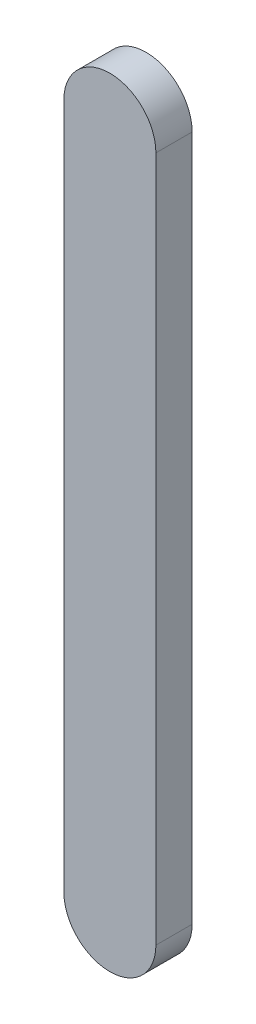
ISO-10303-21;
HEADER;
FILE_DESCRIPTION(('STEP AP214'),'2;1');
FILE_NAME('part.step','',(''),(''),'','','');
FILE_SCHEMA(('AUTOMOTIVE_DESIGN { 1 0 10303 214 1 1 1 1 }'));
ENDSEC;
DATA;
#1=APPLICATION_CONTEXT('core data for automotive mechanical design processes');
#2=APPLICATION_PROTOCOL_DEFINITION('international standard','automotive_design',2000,#1);
#3=PRODUCT_CONTEXT('',#1,'mechanical');
#4=PRODUCT('Part','Part','',(#3));
#5=PRODUCT_RELATED_PRODUCT_CATEGORY('part','',(#4));
#6=PRODUCT_DEFINITION_FORMATION('','',#4);
#7=PRODUCT_DEFINITION_CONTEXT('part definition',#1,'design');
#8=PRODUCT_DEFINITION('design','',#6,#7);
#9=PRODUCT_DEFINITION_SHAPE('','',#8);
#10=(LENGTH_UNIT() NAMED_UNIT(*) SI_UNIT(.MILLI.,.METRE.));
#11=(NAMED_UNIT(*) PLANE_ANGLE_UNIT() SI_UNIT($,.RADIAN.));
#12=(NAMED_UNIT(*) SI_UNIT($,.STERADIAN.) SOLID_ANGLE_UNIT());
#13=UNCERTAINTY_MEASURE_WITH_UNIT(LENGTH_MEASURE(1.E-05),#10,'distance_accuracy_value','');
#14=(GEOMETRIC_REPRESENTATION_CONTEXT(3) GLOBAL_UNCERTAINTY_ASSIGNED_CONTEXT((#13)) GLOBAL_UNIT_ASSIGNED_CONTEXT((#10,
#11,#12)) REPRESENTATION_CONTEXT('',''));
#15=CARTESIAN_POINT('',(0.,0.,0.));
#16=DIRECTION('',(0.,0.,1.));
#17=DIRECTION('',(1.,0.,0.));
#18=AXIS2_PLACEMENT_3D('',#15,#16,#17);
#19=CARTESIAN_POINT('',(147.828,107.5660028,0.));
#20=DIRECTION('',(-1.,0.,0.));
#21=DIRECTION('',(0.,1.,0.));
#22=AXIS2_PLACEMENT_3D('',#19,#20,#21);
#23=PLANE('',#22);
#24=DIRECTION('',(0.,1.,0.));
#25=VECTOR('',#24,1.);
#26=CARTESIAN_POINT('',(147.828,107.5660028,0.1999996));
#27=LINE('',#26,#25);
#28=CARTESIAN_POINT('',(147.828,107.5660028,0.1999996));
#29=VERTEX_POINT('',#28);
#30=CARTESIAN_POINT('',(147.828,111.3536,0.1999996));
#31=VERTEX_POINT('',#30);
#32=EDGE_CURVE('E11',#29,#31,#27,.T.);
#33=ORIENTED_EDGE('',*,*,#32,.F.);
#34=DIRECTION('',(0.,0.,1.));
#35=VECTOR('',#34,1.);
#36=CARTESIAN_POINT('',(147.828,107.5660028,0.));
#37=LINE('',#36,#35);
#38=CARTESIAN_POINT('',(147.828,107.5660028,0.));
#39=VERTEX_POINT('',#38);
#40=EDGE_CURVE('E24',#39,#29,#37,.T.);
#41=ORIENTED_EDGE('',*,*,#40,.F.);
#42=DIRECTION('',(0.,1.,0.));
#43=VECTOR('',#42,1.);
#44=CARTESIAN_POINT('',(147.828,107.5660028,0.));
#45=LINE('',#44,#43);
#46=CARTESIAN_POINT('',(147.828,111.3536,0.));
#47=VERTEX_POINT('',#46);
#48=EDGE_CURVE('E75',#39,#47,#45,.T.);
#49=ORIENTED_EDGE('',*,*,#48,.T.);
#50=DIRECTION('',(0.,0.,1.));
#51=VECTOR('',#50,1.);
#52=CARTESIAN_POINT('',(147.828,111.3536,0.));
#53=LINE('',#52,#51);
#54=EDGE_CURVE('E37',#47,#31,#53,.T.);
#55=ORIENTED_EDGE('',*,*,#54,.T.);
#56=EDGE_LOOP('',(#33,#41,#49,#55));
#57=FACE_BOUND('',#56,.T.);
#58=ADVANCED_FACE('F17',(#57),#23,.F.);
#59=CARTESIAN_POINT('',(147.574,111.3536,0.));
#60=DIRECTION('',(0.,0.,-1.));
#61=DIRECTION('',(1.,0.,0.));
#62=AXIS2_PLACEMENT_3D('',#59,#60,#61);
#63=CYLINDRICAL_SURFACE('',#62,0.254000000000005);
#64=CARTESIAN_POINT('',(147.574,111.3536,0.1999996));
#65=DIRECTION('',(0.,0.,1.));
#66=DIRECTION('',(1.,0.,0.));
#67=AXIS2_PLACEMENT_3D('',#64,#65,#66);
#68=CIRCLE('',#67,0.254000000000005);
#69=CARTESIAN_POINT('',(147.32,111.3536,0.1999996));
#70=VERTEX_POINT('',#69);
#71=EDGE_CURVE('E83',#31,#70,#68,.T.);
#72=ORIENTED_EDGE('',*,*,#71,.F.);
#73=ORIENTED_EDGE('',*,*,#54,.F.);
#74=CARTESIAN_POINT('',(147.574,111.3536,0.));
#75=DIRECTION('',(0.,0.,1.));
#76=DIRECTION('',(1.,0.,0.));
#77=AXIS2_PLACEMENT_3D('',#74,#75,#76);
#78=CIRCLE('',#77,0.254000000000005);
#79=CARTESIAN_POINT('',(147.32,111.3536,0.));
#80=VERTEX_POINT('',#79);
#81=EDGE_CURVE('E81',#47,#80,#78,.T.);
#82=ORIENTED_EDGE('',*,*,#81,.T.);
#83=DIRECTION('',(0.,0.,1.));
#84=VECTOR('',#83,1.);
#85=CARTESIAN_POINT('',(147.32,111.3536,0.));
#86=LINE('',#85,#84);
#87=EDGE_CURVE('E67',#80,#70,#86,.T.);
#88=ORIENTED_EDGE('',*,*,#87,.T.);
#89=EDGE_LOOP('',(#72,#73,#82,#88));
#90=FACE_BOUND('',#89,.T.);
#91=ADVANCED_FACE('F89',(#90),#63,.T.);
#92=CARTESIAN_POINT('',(147.32,111.3536,0.));
#93=DIRECTION('',(1.,0.,0.));
#94=DIRECTION('',(0.,-1.,0.));
#95=AXIS2_PLACEMENT_3D('',#92,#93,#94);
#96=PLANE('',#95);
#97=DIRECTION('',(0.,-1.,0.));
#98=VECTOR('',#97,1.);
#99=CARTESIAN_POINT('',(147.32,111.3536,0.1999996));
#100=LINE('',#99,#98);
#101=CARTESIAN_POINT('',(147.32,107.5660028,0.1999996));
#102=VERTEX_POINT('',#101);
#103=EDGE_CURVE('E71',#70,#102,#100,.T.);
#104=ORIENTED_EDGE('',*,*,#103,.F.);
#105=ORIENTED_EDGE('',*,*,#87,.F.);
#106=DIRECTION('',(0.,-1.,0.));
#107=VECTOR('',#106,1.);
#108=CARTESIAN_POINT('',(147.32,111.3536,0.));
#109=LINE('',#108,#107);
#110=CARTESIAN_POINT('',(147.32,107.5660028,0.));
#111=VERTEX_POINT('',#110);
#112=EDGE_CURVE('E63',#80,#111,#109,.T.);
#113=ORIENTED_EDGE('',*,*,#112,.T.);
#114=DIRECTION('',(0.,0.,1.));
#115=VECTOR('',#114,1.);
#116=CARTESIAN_POINT('',(147.32,107.5660028,0.));
#117=LINE('',#116,#115);
#118=EDGE_CURVE('E53',#111,#102,#117,.T.);
#119=ORIENTED_EDGE('',*,*,#118,.T.);
#120=EDGE_LOOP('',(#104,#105,#113,#119));
#121=FACE_BOUND('',#120,.T.);
#122=ADVANCED_FACE('F66',(#121),#96,.F.);
#123=CARTESIAN_POINT('',(147.574,107.5660028,0.));
#124=DIRECTION('',(0.,0.,-1.));
#125=DIRECTION('',(-1.,0.,0.));
#126=AXIS2_PLACEMENT_3D('',#123,#124,#125);
#127=CYLINDRICAL_SURFACE('',#126,0.25400000000001);
#128=CARTESIAN_POINT('',(147.574,107.5660028,0.1999996));
#129=DIRECTION('',(0.,0.,1.));
#130=DIRECTION('',(-1.,0.,0.));
#131=AXIS2_PLACEMENT_3D('',#128,#129,#130);
#132=CIRCLE('',#131,0.25400000000001);
#133=EDGE_CURVE('E59',#102,#29,#132,.T.);
#134=ORIENTED_EDGE('',*,*,#133,.F.);
#135=ORIENTED_EDGE('',*,*,#118,.F.);
#136=CARTESIAN_POINT('',(147.574,107.5660028,0.));
#137=DIRECTION('',(0.,0.,1.));
#138=DIRECTION('',(-1.,0.,0.));
#139=AXIS2_PLACEMENT_3D('',#136,#137,#138);
#140=CIRCLE('',#139,0.25400000000001);
#141=EDGE_CURVE('E57',#111,#39,#140,.T.);
#142=ORIENTED_EDGE('',*,*,#141,.T.);
#143=ORIENTED_EDGE('',*,*,#40,.T.);
#144=EDGE_LOOP('',(#134,#135,#142,#143));
#145=FACE_BOUND('',#144,.T.);
#146=ADVANCED_FACE('F55',(#145),#127,.T.);
#147=CARTESIAN_POINT('',(147.828,107.5660028,0.));
#148=DIRECTION('',(0.,0.,-1.));
#149=DIRECTION('',(-1.,0.,0.));
#150=AXIS2_PLACEMENT_3D('',#147,#148,#149);
#151=PLANE('',#150);
#152=ORIENTED_EDGE('',*,*,#141,.F.);
#153=ORIENTED_EDGE('',*,*,#112,.F.);
#154=ORIENTED_EDGE('',*,*,#81,.F.);
#155=ORIENTED_EDGE('',*,*,#48,.F.);
#156=EDGE_LOOP('',(#152,#153,#154,#155));
#157=FACE_BOUND('',#156,.T.);
#158=ADVANCED_FACE('F74',(#157),#151,.T.);
#159=CARTESIAN_POINT('',(147.828,107.5660028,0.1999996));
#160=DIRECTION('',(0.,0.,-1.));
#161=DIRECTION('',(-1.,0.,0.));
#162=AXIS2_PLACEMENT_3D('',#159,#160,#161);
#163=PLANE('',#162);
#164=ORIENTED_EDGE('',*,*,#32,.T.);
#165=ORIENTED_EDGE('',*,*,#71,.T.);
#166=ORIENTED_EDGE('',*,*,#103,.T.);
#167=ORIENTED_EDGE('',*,*,#133,.T.);
#168=EDGE_LOOP('',(#164,#165,#166,#167));
#169=FACE_BOUND('',#168,.T.);
#170=ADVANCED_FACE('F91',(#169),#163,.F.);
#171=CLOSED_SHELL('',(#58,#91,#122,#146,#158,#170));
#172=MANIFOLD_SOLID_BREP('B1',#171);
#173=ADVANCED_BREP_SHAPE_REPRESENTATION('',(#18,#172),#14);
#174=SHAPE_DEFINITION_REPRESENTATION(#9,#173);
ENDSEC;
END-ISO-10303-21;
